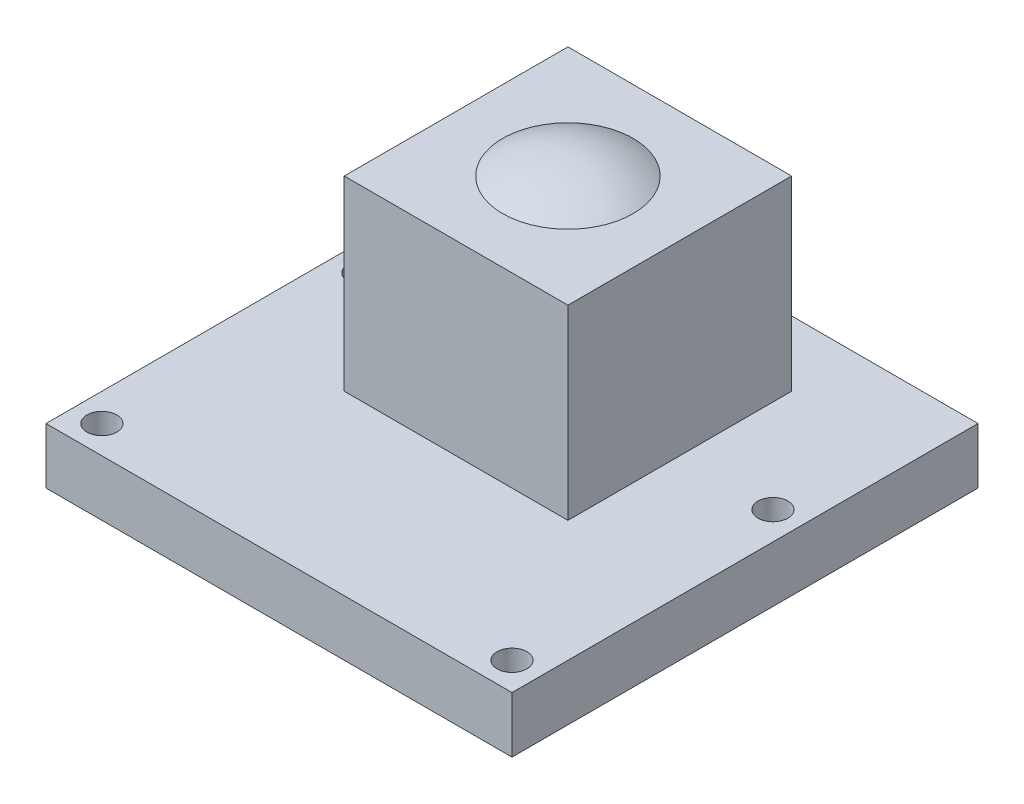
ISO-10303-21;
HEADER;
FILE_DESCRIPTION(('STEP AP214'),'2;1');
FILE_NAME('part.step','',(''),(''),'','','');
FILE_SCHEMA(('AUTOMOTIVE_DESIGN { 1 0 10303 214 1 1 1 1 }'));
ENDSEC;
DATA;
#1=APPLICATION_CONTEXT('core data for automotive mechanical design processes');
#2=APPLICATION_PROTOCOL_DEFINITION('international standard','automotive_design',2000,#1);
#3=PRODUCT_CONTEXT('',#1,'mechanical');
#4=PRODUCT('Part','Part','',(#3));
#5=PRODUCT_RELATED_PRODUCT_CATEGORY('part','',(#4));
#6=PRODUCT_DEFINITION_FORMATION('','',#4);
#7=PRODUCT_DEFINITION_CONTEXT('part definition',#1,'design');
#8=PRODUCT_DEFINITION('design','',#6,#7);
#9=PRODUCT_DEFINITION_SHAPE('','',#8);
#10=(LENGTH_UNIT() NAMED_UNIT(*) SI_UNIT(.MILLI.,.METRE.));
#11=(NAMED_UNIT(*) PLANE_ANGLE_UNIT() SI_UNIT($,.RADIAN.));
#12=(NAMED_UNIT(*) SI_UNIT($,.STERADIAN.) SOLID_ANGLE_UNIT());
#13=UNCERTAINTY_MEASURE_WITH_UNIT(LENGTH_MEASURE(1.E-05),#10,'distance_accuracy_value','');
#14=(GEOMETRIC_REPRESENTATION_CONTEXT(3) GLOBAL_UNCERTAINTY_ASSIGNED_CONTEXT((#13)) GLOBAL_UNIT_ASSIGNED_CONTEXT((#10,
#11,#12)) REPRESENTATION_CONTEXT('',''));
#15=CARTESIAN_POINT('',(0.,0.,0.));
#16=DIRECTION('',(0.,0.,1.));
#17=DIRECTION('',(1.,0.,0.));
#18=AXIS2_PLACEMENT_3D('',#15,#16,#17);
#19=CARTESIAN_POINT('',(0.,13.,0.));
#20=DIRECTION('',(0.,1.,0.));
#21=DIRECTION('',(0.,0.,1.));
#22=AXIS2_PLACEMENT_3D('',#19,#20,#21);
#23=PLANE('',#22);
#24=DIRECTION('',(0.,0.,-1.));
#25=VECTOR('',#24,1.);
#26=CARTESIAN_POINT('',(6.,13.,-9.00000000000001));
#27=LINE('',#26,#25);
#28=CARTESIAN_POINT('',(6.,13.,2.99999999999999));
#29=VERTEX_POINT('',#28);
#30=CARTESIAN_POINT('',(6.,13.,-9.00000000000001));
#31=VERTEX_POINT('',#30);
#32=EDGE_CURVE('E126',#29,#31,#27,.T.);
#33=ORIENTED_EDGE('',*,*,#32,.T.);
#34=DIRECTION('',(-1.,0.,0.));
#35=VECTOR('',#34,1.);
#36=CARTESIAN_POINT('',(-6.,13.,-9.00000000000001));
#37=LINE('',#36,#35);
#38=CARTESIAN_POINT('',(-6.,13.,-9.00000000000001));
#39=VERTEX_POINT('',#38);
#40=EDGE_CURVE('E115',#31,#39,#37,.T.);
#41=ORIENTED_EDGE('',*,*,#40,.T.);
#42=DIRECTION('',(0.,0.,1.));
#43=VECTOR('',#42,1.);
#44=CARTESIAN_POINT('',(-6.,13.,-9.00000000000001));
#45=LINE('',#44,#43);
#46=CARTESIAN_POINT('',(-6.,13.,2.99999999999999));
#47=VERTEX_POINT('',#46);
#48=EDGE_CURVE('E125',#39,#47,#45,.T.);
#49=ORIENTED_EDGE('',*,*,#48,.T.);
#50=DIRECTION('',(1.,0.,0.));
#51=VECTOR('',#50,1.);
#52=CARTESIAN_POINT('',(-6.,13.,2.99999999999999));
#53=LINE('',#52,#51);
#54=EDGE_CURVE('E130',#47,#29,#53,.T.);
#55=ORIENTED_EDGE('',*,*,#54,.T.);
#56=EDGE_LOOP('',(#33,#41,#49,#55));
#57=FACE_BOUND('',#56,.T.);
#58=CARTESIAN_POINT('',(0.,13.,-3.00000000000001));
#59=DIRECTION('',(0.,1.,0.));
#60=DIRECTION('',(0.,0.,1.));
#61=AXIS2_PLACEMENT_3D('',#58,#59,#60);
#62=CIRCLE('',#61,3.5);
#63=CARTESIAN_POINT('',(0.,13.,0.499999999999993));
#64=VERTEX_POINT('',#63);
#65=EDGE_CURVE('E11',#64,#64,#62,.F.);
#66=ORIENTED_EDGE('',*,*,#65,.T.);
#67=EDGE_LOOP('',(#66));
#68=FACE_BOUND('',#67,.T.);
#69=ADVANCED_FACE('F39',(#57,#68),#23,.T.);
#70=CARTESIAN_POINT('',(0.,3.,0.));
#71=DIRECTION('',(0.,1.,0.));
#72=DIRECTION('',(0.,0.,1.));
#73=AXIS2_PLACEMENT_3D('',#70,#71,#72);
#74=PLANE('',#73);
#75=CARTESIAN_POINT('',(-11.,3.,-3.00000000000001));
#76=DIRECTION('',(0.,1.,0.));
#77=DIRECTION('',(0.,0.,1.));
#78=AXIS2_PLACEMENT_3D('',#75,#76,#77);
#79=CIRCLE('',#78,0.799999999999999);
#80=CARTESIAN_POINT('',(-11.,3.,-2.20000000000001));
#81=VERTEX_POINT('',#80);
#82=EDGE_CURVE('E140',#81,#81,#79,.T.);
#83=ORIENTED_EDGE('',*,*,#82,.F.);
#84=EDGE_LOOP('',(#83));
#85=FACE_BOUND('',#84,.T.);
#86=CARTESIAN_POINT('',(-11.,3.,11.));
#87=DIRECTION('',(0.,1.,0.));
#88=DIRECTION('',(0.,0.,1.));
#89=AXIS2_PLACEMENT_3D('',#86,#87,#88);
#90=CIRCLE('',#89,0.799999999999999);
#91=CARTESIAN_POINT('',(-11.,3.,11.8));
#92=VERTEX_POINT('',#91);
#93=EDGE_CURVE('E150',#92,#92,#90,.T.);
#94=ORIENTED_EDGE('',*,*,#93,.F.);
#95=EDGE_LOOP('',(#94));
#96=FACE_BOUND('',#95,.T.);
#97=CARTESIAN_POINT('',(11.,3.,11.));
#98=DIRECTION('',(0.,1.,0.));
#99=DIRECTION('',(0.,0.,1.));
#100=AXIS2_PLACEMENT_3D('',#97,#98,#99);
#101=CIRCLE('',#100,0.799999999999999);
#102=CARTESIAN_POINT('',(11.,3.,11.8));
#103=VERTEX_POINT('',#102);
#104=EDGE_CURVE('E156',#103,#103,#101,.T.);
#105=ORIENTED_EDGE('',*,*,#104,.F.);
#106=EDGE_LOOP('',(#105));
#107=FACE_BOUND('',#106,.T.);
#108=CARTESIAN_POINT('',(11.,3.,-3.00000000000001));
#109=DIRECTION('',(0.,1.,0.));
#110=DIRECTION('',(0.,0.,1.));
#111=AXIS2_PLACEMENT_3D('',#108,#109,#110);
#112=CIRCLE('',#111,0.799999999999999);
#113=CARTESIAN_POINT('',(11.,3.,-2.20000000000001));
#114=VERTEX_POINT('',#113);
#115=EDGE_CURVE('E162',#114,#114,#112,.T.);
#116=ORIENTED_EDGE('',*,*,#115,.F.);
#117=EDGE_LOOP('',(#116));
#118=FACE_BOUND('',#117,.T.);
#119=DIRECTION('',(0.,0.,1.));
#120=VECTOR('',#119,1.);
#121=CARTESIAN_POINT('',(-12.5,3.,-12.5));
#122=LINE('',#121,#120);
#123=CARTESIAN_POINT('',(-12.5,3.,-12.5));
#124=VERTEX_POINT('',#123);
#125=CARTESIAN_POINT('',(-12.5,3.,12.5));
#126=VERTEX_POINT('',#125);
#127=EDGE_CURVE('E169',#124,#126,#122,.T.);
#128=ORIENTED_EDGE('',*,*,#127,.T.);
#129=DIRECTION('',(1.,0.,0.));
#130=VECTOR('',#129,1.);
#131=CARTESIAN_POINT('',(-12.5,3.,12.5));
#132=LINE('',#131,#130);
#133=CARTESIAN_POINT('',(12.5,3.,12.5));
#134=VERTEX_POINT('',#133);
#135=EDGE_CURVE('E93',#126,#134,#132,.T.);
#136=ORIENTED_EDGE('',*,*,#135,.T.);
#137=DIRECTION('',(0.,0.,-1.));
#138=VECTOR('',#137,1.);
#139=CARTESIAN_POINT('',(12.5,3.,12.5));
#140=LINE('',#139,#138);
#141=CARTESIAN_POINT('',(12.5,3.,-12.5));
#142=VERTEX_POINT('',#141);
#143=EDGE_CURVE('E172',#134,#142,#140,.T.);
#144=ORIENTED_EDGE('',*,*,#143,.T.);
#145=DIRECTION('',(-1.,0.,0.));
#146=VECTOR('',#145,1.);
#147=CARTESIAN_POINT('',(12.5,3.,-12.5));
#148=LINE('',#147,#146);
#149=EDGE_CURVE('E64',#142,#124,#148,.T.);
#150=ORIENTED_EDGE('',*,*,#149,.T.);
#151=EDGE_LOOP('',(#128,#136,#144,#150));
#152=FACE_BOUND('',#151,.T.);
#153=DIRECTION('',(-1.,0.,0.));
#154=VECTOR('',#153,1.);
#155=CARTESIAN_POINT('',(-6.,3.,-9.00000000000001));
#156=LINE('',#155,#154);
#157=CARTESIAN_POINT('',(6.,3.,-9.00000000000001));
#158=VERTEX_POINT('',#157);
#159=CARTESIAN_POINT('',(-6.,3.,-9.00000000000001));
#160=VERTEX_POINT('',#159);
#161=EDGE_CURVE('E208',#158,#160,#156,.T.);
#162=ORIENTED_EDGE('',*,*,#161,.F.);
#163=DIRECTION('',(0.,0.,-1.));
#164=VECTOR('',#163,1.);
#165=CARTESIAN_POINT('',(6.,3.,-9.00000000000001));
#166=LINE('',#165,#164);
#167=CARTESIAN_POINT('',(6.,3.,2.99999999999999));
#168=VERTEX_POINT('',#167);
#169=EDGE_CURVE('E138',#168,#158,#166,.T.);
#170=ORIENTED_EDGE('',*,*,#169,.F.);
#171=DIRECTION('',(1.,0.,0.));
#172=VECTOR('',#171,1.);
#173=CARTESIAN_POINT('',(-6.,3.,2.99999999999999));
#174=LINE('',#173,#172);
#175=CARTESIAN_POINT('',(-6.,3.,2.99999999999999));
#176=VERTEX_POINT('',#175);
#177=EDGE_CURVE('E134',#176,#168,#174,.T.);
#178=ORIENTED_EDGE('',*,*,#177,.F.);
#179=DIRECTION('',(0.,0.,1.));
#180=VECTOR('',#179,1.);
#181=CARTESIAN_POINT('',(-6.,3.,-9.00000000000001));
#182=LINE('',#181,#180);
#183=EDGE_CURVE('E210',#160,#176,#182,.T.);
#184=ORIENTED_EDGE('',*,*,#183,.F.);
#185=EDGE_LOOP('',(#162,#170,#178,#184));
#186=FACE_BOUND('',#185,.T.);
#187=ADVANCED_FACE('F202',(#85,#96,#107,#118,#152,#186),#74,.T.);
#188=CARTESIAN_POINT('',(-12.5,3.,-12.5));
#189=DIRECTION('',(1.,0.,0.));
#190=DIRECTION('',(0.,0.,-1.));
#191=AXIS2_PLACEMENT_3D('',#188,#189,#190);
#192=PLANE('',#191);
#193=DIRECTION('',(0.,0.,1.));
#194=VECTOR('',#193,1.);
#195=CARTESIAN_POINT('',(-12.5,0.,-12.5));
#196=LINE('',#195,#194);
#197=CARTESIAN_POINT('',(-12.5,0.,-12.5));
#198=VERTEX_POINT('',#197);
#199=CARTESIAN_POINT('',(-12.5,0.,12.5));
#200=VERTEX_POINT('',#199);
#201=EDGE_CURVE('E168',#198,#200,#196,.T.);
#202=ORIENTED_EDGE('',*,*,#201,.T.);
#203=DIRECTION('',(0.,-1.,0.));
#204=VECTOR('',#203,1.);
#205=CARTESIAN_POINT('',(-12.5,3.,12.5));
#206=LINE('',#205,#204);
#207=EDGE_CURVE('E48',#126,#200,#206,.T.);
#208=ORIENTED_EDGE('',*,*,#207,.F.);
#209=ORIENTED_EDGE('',*,*,#127,.F.);
#210=DIRECTION('',(0.,-1.,0.));
#211=VECTOR('',#210,1.);
#212=CARTESIAN_POINT('',(-12.5,3.,-12.5));
#213=LINE('',#212,#211);
#214=EDGE_CURVE('E175',#124,#198,#213,.T.);
#215=ORIENTED_EDGE('',*,*,#214,.T.);
#216=EDGE_LOOP('',(#202,#208,#209,#215));
#217=FACE_BOUND('',#216,.T.);
#218=ADVANCED_FACE('F193',(#217),#192,.F.);
#219=CARTESIAN_POINT('',(-12.5,3.,12.5));
#220=DIRECTION('',(0.,0.,-1.));
#221=DIRECTION('',(-1.,0.,0.));
#222=AXIS2_PLACEMENT_3D('',#219,#220,#221);
#223=PLANE('',#222);
#224=DIRECTION('',(1.,0.,0.));
#225=VECTOR('',#224,1.);
#226=CARTESIAN_POINT('',(-12.5,0.,12.5));
#227=LINE('',#226,#225);
#228=CARTESIAN_POINT('',(12.5,0.,12.5));
#229=VERTEX_POINT('',#228);
#230=EDGE_CURVE('E178',#200,#229,#227,.T.);
#231=ORIENTED_EDGE('',*,*,#230,.T.);
#232=DIRECTION('',(0.,-1.,0.));
#233=VECTOR('',#232,1.);
#234=CARTESIAN_POINT('',(12.5,3.,12.5));
#235=LINE('',#234,#233);
#236=EDGE_CURVE('E186',#134,#229,#235,.T.);
#237=ORIENTED_EDGE('',*,*,#236,.F.);
#238=ORIENTED_EDGE('',*,*,#135,.F.);
#239=ORIENTED_EDGE('',*,*,#207,.T.);
#240=EDGE_LOOP('',(#231,#237,#238,#239));
#241=FACE_BOUND('',#240,.T.);
#242=ADVANCED_FACE('F189',(#241),#223,.F.);
#243=CARTESIAN_POINT('',(12.5,3.,12.5));
#244=DIRECTION('',(-1.,0.,0.));
#245=DIRECTION('',(0.,0.,1.));
#246=AXIS2_PLACEMENT_3D('',#243,#244,#245);
#247=PLANE('',#246);
#248=DIRECTION('',(0.,0.,-1.));
#249=VECTOR('',#248,1.);
#250=CARTESIAN_POINT('',(12.5,0.,12.5));
#251=LINE('',#250,#249);
#252=CARTESIAN_POINT('',(12.5,0.,-12.5));
#253=VERTEX_POINT('',#252);
#254=EDGE_CURVE('E180',#229,#253,#251,.T.);
#255=ORIENTED_EDGE('',*,*,#254,.T.);
#256=DIRECTION('',(0.,-1.,0.));
#257=VECTOR('',#256,1.);
#258=CARTESIAN_POINT('',(12.5,3.,-12.5));
#259=LINE('',#258,#257);
#260=EDGE_CURVE('E184',#142,#253,#259,.T.);
#261=ORIENTED_EDGE('',*,*,#260,.F.);
#262=ORIENTED_EDGE('',*,*,#143,.F.);
#263=ORIENTED_EDGE('',*,*,#236,.T.);
#264=EDGE_LOOP('',(#255,#261,#262,#263));
#265=FACE_BOUND('',#264,.T.);
#266=ADVANCED_FACE('F199',(#265),#247,.F.);
#267=CARTESIAN_POINT('',(12.5,3.,-12.5));
#268=DIRECTION('',(0.,0.,1.));
#269=DIRECTION('',(1.,0.,0.));
#270=AXIS2_PLACEMENT_3D('',#267,#268,#269);
#271=PLANE('',#270);
#272=DIRECTION('',(-1.,0.,0.));
#273=VECTOR('',#272,1.);
#274=CARTESIAN_POINT('',(12.5,0.,-12.5));
#275=LINE('',#274,#273);
#276=EDGE_CURVE('E85',#253,#198,#275,.T.);
#277=ORIENTED_EDGE('',*,*,#276,.T.);
#278=ORIENTED_EDGE('',*,*,#214,.F.);
#279=ORIENTED_EDGE('',*,*,#149,.F.);
#280=ORIENTED_EDGE('',*,*,#260,.T.);
#281=EDGE_LOOP('',(#277,#278,#279,#280));
#282=FACE_BOUND('',#281,.T.);
#283=ADVANCED_FACE('F201',(#282),#271,.F.);
#284=CARTESIAN_POINT('',(0.,0.,0.));
#285=DIRECTION('',(0.,1.,0.));
#286=DIRECTION('',(0.,0.,1.));
#287=AXIS2_PLACEMENT_3D('',#284,#285,#286);
#288=PLANE('',#287);
#289=CARTESIAN_POINT('',(-11.,0.,-3.00000000000001));
#290=DIRECTION('',(0.,1.,0.));
#291=DIRECTION('',(0.,0.,1.));
#292=AXIS2_PLACEMENT_3D('',#289,#290,#291);
#293=CIRCLE('',#292,0.799999999999999);
#294=CARTESIAN_POINT('',(-11.,0.,-2.20000000000001));
#295=VERTEX_POINT('',#294);
#296=EDGE_CURVE('E143',#295,#295,#293,.T.);
#297=ORIENTED_EDGE('',*,*,#296,.T.);
#298=EDGE_LOOP('',(#297));
#299=FACE_BOUND('',#298,.T.);
#300=CARTESIAN_POINT('',(-11.,0.,11.));
#301=DIRECTION('',(0.,1.,0.));
#302=DIRECTION('',(0.,0.,1.));
#303=AXIS2_PLACEMENT_3D('',#300,#301,#302);
#304=CIRCLE('',#303,0.799999999999999);
#305=CARTESIAN_POINT('',(-11.,0.,11.8));
#306=VERTEX_POINT('',#305);
#307=EDGE_CURVE('E153',#306,#306,#304,.T.);
#308=ORIENTED_EDGE('',*,*,#307,.T.);
#309=EDGE_LOOP('',(#308));
#310=FACE_BOUND('',#309,.T.);
#311=CARTESIAN_POINT('',(11.,0.,11.));
#312=DIRECTION('',(0.,1.,0.));
#313=DIRECTION('',(0.,0.,1.));
#314=AXIS2_PLACEMENT_3D('',#311,#312,#313);
#315=CIRCLE('',#314,0.799999999999999);
#316=CARTESIAN_POINT('',(11.,0.,11.8));
#317=VERTEX_POINT('',#316);
#318=EDGE_CURVE('E159',#317,#317,#315,.T.);
#319=ORIENTED_EDGE('',*,*,#318,.T.);
#320=EDGE_LOOP('',(#319));
#321=FACE_BOUND('',#320,.T.);
#322=CARTESIAN_POINT('',(11.,0.,-3.00000000000001));
#323=DIRECTION('',(0.,1.,0.));
#324=DIRECTION('',(0.,0.,1.));
#325=AXIS2_PLACEMENT_3D('',#322,#323,#324);
#326=CIRCLE('',#325,0.799999999999999);
#327=CARTESIAN_POINT('',(11.,0.,-2.20000000000001));
#328=VERTEX_POINT('',#327);
#329=EDGE_CURVE('E165',#328,#328,#326,.T.);
#330=ORIENTED_EDGE('',*,*,#329,.T.);
#331=EDGE_LOOP('',(#330));
#332=FACE_BOUND('',#331,.T.);
#333=ORIENTED_EDGE('',*,*,#201,.F.);
#334=ORIENTED_EDGE('',*,*,#276,.F.);
#335=ORIENTED_EDGE('',*,*,#254,.F.);
#336=ORIENTED_EDGE('',*,*,#230,.F.);
#337=EDGE_LOOP('',(#333,#334,#335,#336));
#338=FACE_BOUND('',#337,.T.);
#339=ADVANCED_FACE('F195',(#299,#310,#321,#332,#338),#288,.F.);
#340=CARTESIAN_POINT('',(11.,3.,-3.00000000000001));
#341=DIRECTION('',(0.,1.,0.));
#342=DIRECTION('',(0.,0.,1.));
#343=AXIS2_PLACEMENT_3D('',#340,#341,#342);
#344=CYLINDRICAL_SURFACE('',#343,0.799999999999999);
#345=ORIENTED_EDGE('',*,*,#329,.F.);
#346=EDGE_LOOP('',(#345));
#347=FACE_BOUND('',#346,.T.);
#348=ORIENTED_EDGE('',*,*,#115,.T.);
#349=EDGE_LOOP('',(#348));
#350=FACE_BOUND('',#349,.T.);
#351=ADVANCED_FACE('F271',(#347,#350),#344,.F.);
#352=CARTESIAN_POINT('',(11.,3.,11.));
#353=DIRECTION('',(0.,1.,0.));
#354=DIRECTION('',(0.,0.,1.));
#355=AXIS2_PLACEMENT_3D('',#352,#353,#354);
#356=CYLINDRICAL_SURFACE('',#355,0.799999999999999);
#357=ORIENTED_EDGE('',*,*,#318,.F.);
#358=EDGE_LOOP('',(#357));
#359=FACE_BOUND('',#358,.T.);
#360=ORIENTED_EDGE('',*,*,#104,.T.);
#361=EDGE_LOOP('',(#360));
#362=FACE_BOUND('',#361,.T.);
#363=ADVANCED_FACE('F280',(#359,#362),#356,.F.);
#364=CARTESIAN_POINT('',(-11.,3.,11.));
#365=DIRECTION('',(0.,1.,0.));
#366=DIRECTION('',(0.,0.,1.));
#367=AXIS2_PLACEMENT_3D('',#364,#365,#366);
#368=CYLINDRICAL_SURFACE('',#367,0.799999999999999);
#369=ORIENTED_EDGE('',*,*,#307,.F.);
#370=EDGE_LOOP('',(#369));
#371=FACE_BOUND('',#370,.T.);
#372=ORIENTED_EDGE('',*,*,#93,.T.);
#373=EDGE_LOOP('',(#372));
#374=FACE_BOUND('',#373,.T.);
#375=ADVANCED_FACE('F287',(#371,#374),#368,.F.);
#376=CARTESIAN_POINT('',(-11.,3.,-3.00000000000001));
#377=DIRECTION('',(0.,1.,0.));
#378=DIRECTION('',(0.,0.,1.));
#379=AXIS2_PLACEMENT_3D('',#376,#377,#378);
#380=CYLINDRICAL_SURFACE('',#379,0.799999999999999);
#381=ORIENTED_EDGE('',*,*,#296,.F.);
#382=EDGE_LOOP('',(#381));
#383=FACE_BOUND('',#382,.T.);
#384=ORIENTED_EDGE('',*,*,#82,.T.);
#385=EDGE_LOOP('',(#384));
#386=FACE_BOUND('',#385,.T.);
#387=ADVANCED_FACE('F295',(#383,#386),#380,.F.);
#388=CARTESIAN_POINT('',(6.,13.,-9.00000000000001));
#389=DIRECTION('',(-1.,0.,0.));
#390=DIRECTION('',(0.,0.,1.));
#391=AXIS2_PLACEMENT_3D('',#388,#389,#390);
#392=PLANE('',#391);
#393=ORIENTED_EDGE('',*,*,#169,.T.);
#394=DIRECTION('',(0.,-1.,0.));
#395=VECTOR('',#394,1.);
#396=CARTESIAN_POINT('',(6.,13.,-9.00000000000001));
#397=LINE('',#396,#395);
#398=EDGE_CURVE('E119',#31,#158,#397,.T.);
#399=ORIENTED_EDGE('',*,*,#398,.F.);
#400=ORIENTED_EDGE('',*,*,#32,.F.);
#401=DIRECTION('',(0.,-1.,0.));
#402=VECTOR('',#401,1.);
#403=CARTESIAN_POINT('',(6.,13.,2.99999999999999));
#404=LINE('',#403,#402);
#405=EDGE_CURVE('E217',#29,#168,#404,.T.);
#406=ORIENTED_EDGE('',*,*,#405,.T.);
#407=EDGE_LOOP('',(#393,#399,#400,#406));
#408=FACE_BOUND('',#407,.T.);
#409=ADVANCED_FACE('F136',(#408),#392,.F.);
#410=CARTESIAN_POINT('',(-6.,13.,-9.00000000000001));
#411=DIRECTION('',(0.,0.,1.));
#412=DIRECTION('',(1.,0.,0.));
#413=AXIS2_PLACEMENT_3D('',#410,#411,#412);
#414=PLANE('',#413);
#415=ORIENTED_EDGE('',*,*,#161,.T.);
#416=DIRECTION('',(0.,-1.,0.));
#417=VECTOR('',#416,1.);
#418=CARTESIAN_POINT('',(-6.,13.,-9.00000000000001));
#419=LINE('',#418,#417);
#420=EDGE_CURVE('E122',#39,#160,#419,.T.);
#421=ORIENTED_EDGE('',*,*,#420,.F.);
#422=ORIENTED_EDGE('',*,*,#40,.F.);
#423=ORIENTED_EDGE('',*,*,#398,.T.);
#424=EDGE_LOOP('',(#415,#421,#422,#423));
#425=FACE_BOUND('',#424,.T.);
#426=ADVANCED_FACE('F117',(#425),#414,.F.);
#427=CARTESIAN_POINT('',(-6.,13.,-9.00000000000001));
#428=DIRECTION('',(1.,0.,0.));
#429=DIRECTION('',(0.,0.,-1.));
#430=AXIS2_PLACEMENT_3D('',#427,#428,#429);
#431=PLANE('',#430);
#432=ORIENTED_EDGE('',*,*,#183,.T.);
#433=DIRECTION('',(0.,-1.,0.));
#434=VECTOR('',#433,1.);
#435=CARTESIAN_POINT('',(-6.,13.,2.99999999999999));
#436=LINE('',#435,#434);
#437=EDGE_CURVE('E55',#47,#176,#436,.T.);
#438=ORIENTED_EDGE('',*,*,#437,.F.);
#439=ORIENTED_EDGE('',*,*,#48,.F.);
#440=ORIENTED_EDGE('',*,*,#420,.T.);
#441=EDGE_LOOP('',(#432,#438,#439,#440));
#442=FACE_BOUND('',#441,.T.);
#443=ADVANCED_FACE('F220',(#442),#431,.F.);
#444=CARTESIAN_POINT('',(-6.,13.,2.99999999999999));
#445=DIRECTION('',(0.,0.,-1.));
#446=DIRECTION('',(-1.,0.,0.));
#447=AXIS2_PLACEMENT_3D('',#444,#445,#446);
#448=PLANE('',#447);
#449=ORIENTED_EDGE('',*,*,#177,.T.);
#450=ORIENTED_EDGE('',*,*,#405,.F.);
#451=ORIENTED_EDGE('',*,*,#54,.F.);
#452=ORIENTED_EDGE('',*,*,#437,.T.);
#453=EDGE_LOOP('',(#449,#450,#451,#452));
#454=FACE_BOUND('',#453,.T.);
#455=ADVANCED_FACE('F221',(#454),#448,.F.);
#456=CARTESIAN_POINT('',(0.,7.37500000000001,-3.00000000000001));
#457=DIRECTION('',(0.,0.,1.));
#458=DIRECTION('',(1.,0.,0.));
#459=AXIS2_PLACEMENT_3D('',#456,#457,#458);
#460=SPHERICAL_SURFACE('',#459,6.625);
#461=CARTESIAN_POINT('',(0.,7.37500000000001,-3.00000000000001));
#462=DIRECTION('',(0.,1.,0.));
#463=DIRECTION('',(0.,0.,1.));
#464=AXIS2_PLACEMENT_3D('',#461,#462,#463);
#465=SPHERICAL_SURFACE('',#464,6.625);
#466=ORIENTED_EDGE('',*,*,#65,.F.);
#467=EDGE_LOOP('',(#466));
#468=FACE_BOUND('',#467,.T.);
#469=ADVANCED_FACE('F41',(#468),#465,.T.);
#470=CLOSED_SHELL('',(#69,#187,#218,#242,#266,#283,#339,#351,#363,#375,#387,#409,#426,#443,#455,#469));
#471=MANIFOLD_SOLID_BREP('B2',#470);
#472=ADVANCED_BREP_SHAPE_REPRESENTATION('',(#18,#471),#14);
#473=SHAPE_DEFINITION_REPRESENTATION(#9,#472);
ENDSEC;
END-ISO-10303-21;
